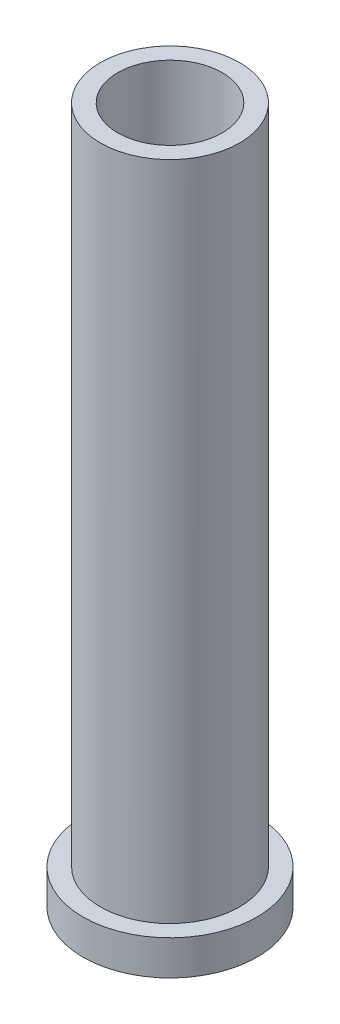
ISO-10303-21;
HEADER;
FILE_DESCRIPTION(('STEP AP214'),'2;1');
FILE_NAME('part.step','',(''),(''),'','','');
FILE_SCHEMA(('AUTOMOTIVE_DESIGN { 1 0 10303 214 1 1 1 1 }'));
ENDSEC;
DATA;
#1=APPLICATION_CONTEXT('core data for automotive mechanical design processes');
#2=APPLICATION_PROTOCOL_DEFINITION('international standard','automotive_design',2000,#1);
#3=PRODUCT_CONTEXT('',#1,'mechanical');
#4=PRODUCT('Part','Part','',(#3));
#5=PRODUCT_RELATED_PRODUCT_CATEGORY('part','',(#4));
#6=PRODUCT_DEFINITION_FORMATION('','',#4);
#7=PRODUCT_DEFINITION_CONTEXT('part definition',#1,'design');
#8=PRODUCT_DEFINITION('design','',#6,#7);
#9=PRODUCT_DEFINITION_SHAPE('','',#8);
#10=(LENGTH_UNIT() NAMED_UNIT(*) SI_UNIT(.MILLI.,.METRE.));
#11=(NAMED_UNIT(*) PLANE_ANGLE_UNIT() SI_UNIT($,.RADIAN.));
#12=(NAMED_UNIT(*) SI_UNIT($,.STERADIAN.) SOLID_ANGLE_UNIT());
#13=UNCERTAINTY_MEASURE_WITH_UNIT(LENGTH_MEASURE(1.E-05),#10,'distance_accuracy_value','');
#14=(GEOMETRIC_REPRESENTATION_CONTEXT(3) GLOBAL_UNCERTAINTY_ASSIGNED_CONTEXT((#13)) GLOBAL_UNIT_ASSIGNED_CONTEXT((#10,
#11,#12)) REPRESENTATION_CONTEXT('',''));
#15=CARTESIAN_POINT('',(0.,0.,0.));
#16=DIRECTION('',(0.,0.,1.));
#17=DIRECTION('',(1.,0.,0.));
#18=AXIS2_PLACEMENT_3D('',#15,#16,#17);
#19=CARTESIAN_POINT('',(0.,38.,0.));
#20=DIRECTION('',(0.,-1.,0.));
#21=DIRECTION('',(0.,0.,-1.));
#22=AXIS2_PLACEMENT_3D('',#19,#20,#21);
#23=CYLINDRICAL_SURFACE('',#22,4.);
#24=CARTESIAN_POINT('',(0.,38.,0.));
#25=DIRECTION('',(0.,1.,0.));
#26=DIRECTION('',(0.,0.,1.));
#27=AXIS2_PLACEMENT_3D('',#24,#25,#26);
#28=CIRCLE('',#27,4.);
#29=CARTESIAN_POINT('',(0.,38.,4.));
#30=VERTEX_POINT('',#29);
#31=EDGE_CURVE('E10',#30,#30,#28,.T.);
#32=ORIENTED_EDGE('',*,*,#31,.F.);
#33=EDGE_LOOP('',(#32));
#34=FACE_BOUND('',#33,.T.);
#35=CARTESIAN_POINT('',(0.,0.,0.));
#36=DIRECTION('',(0.,-1.,0.));
#37=DIRECTION('',(0.,0.,-1.));
#38=AXIS2_PLACEMENT_3D('',#35,#36,#37);
#39=CIRCLE('',#38,4.);
#40=CARTESIAN_POINT('',(0.,0.,-4.));
#41=VERTEX_POINT('',#40);
#42=EDGE_CURVE('E37',#41,#41,#39,.T.);
#43=ORIENTED_EDGE('',*,*,#42,.F.);
#44=EDGE_LOOP('',(#43));
#45=FACE_BOUND('',#44,.T.);
#46=ADVANCED_FACE('F30',(#34,#45),#23,.T.);
#47=CARTESIAN_POINT('',(0.,38.,0.));
#48=DIRECTION('',(0.,1.,0.));
#49=DIRECTION('',(0.,0.,1.));
#50=AXIS2_PLACEMENT_3D('',#47,#48,#49);
#51=PLANE('',#50);
#52=CARTESIAN_POINT('',(0.,38.,0.));
#53=DIRECTION('',(0.,1.,0.));
#54=DIRECTION('',(0.,0.,1.));
#55=AXIS2_PLACEMENT_3D('',#52,#53,#54);
#56=CIRCLE('',#55,3.);
#57=CARTESIAN_POINT('',(0.,38.,3.));
#58=VERTEX_POINT('',#57);
#59=EDGE_CURVE('E49',#58,#58,#56,.T.);
#60=ORIENTED_EDGE('',*,*,#59,.F.);
#61=EDGE_LOOP('',(#60));
#62=FACE_BOUND('',#61,.T.);
#63=ORIENTED_EDGE('',*,*,#31,.T.);
#64=EDGE_LOOP('',(#63));
#65=FACE_BOUND('',#64,.T.);
#66=ADVANCED_FACE('F68',(#62,#65),#51,.T.);
#67=CARTESIAN_POINT('',(0.,-2.,0.));
#68=DIRECTION('',(0.,1.,0.));
#69=DIRECTION('',(0.,0.,1.));
#70=AXIS2_PLACEMENT_3D('',#67,#68,#69);
#71=CYLINDRICAL_SURFACE('',#70,5.);
#72=CARTESIAN_POINT('',(0.,-2.,0.));
#73=DIRECTION('',(0.,-1.,0.));
#74=DIRECTION('',(0.,0.,-1.));
#75=AXIS2_PLACEMENT_3D('',#72,#73,#74);
#76=CIRCLE('',#75,5.);
#77=CARTESIAN_POINT('',(0.,-2.,-5.));
#78=VERTEX_POINT('',#77);
#79=EDGE_CURVE('E41',#78,#78,#76,.T.);
#80=ORIENTED_EDGE('',*,*,#79,.F.);
#81=EDGE_LOOP('',(#80));
#82=FACE_BOUND('',#81,.T.);
#83=CARTESIAN_POINT('',(0.,0.,0.));
#84=DIRECTION('',(0.,-1.,0.));
#85=DIRECTION('',(0.,0.,-1.));
#86=AXIS2_PLACEMENT_3D('',#83,#84,#85);
#87=CIRCLE('',#86,5.);
#88=CARTESIAN_POINT('',(0.,0.,-5.));
#89=VERTEX_POINT('',#88);
#90=EDGE_CURVE('E44',#89,#89,#87,.T.);
#91=ORIENTED_EDGE('',*,*,#90,.T.);
#92=EDGE_LOOP('',(#91));
#93=FACE_BOUND('',#92,.T.);
#94=ADVANCED_FACE('F62',(#82,#93),#71,.T.);
#95=CARTESIAN_POINT('',(0.,-2.,0.));
#96=DIRECTION('',(0.,-1.,0.));
#97=DIRECTION('',(0.,0.,-1.));
#98=AXIS2_PLACEMENT_3D('',#95,#96,#97);
#99=PLANE('',#98);
#100=CARTESIAN_POINT('',(0.,-2.,0.));
#101=DIRECTION('',(0.,-1.,0.));
#102=DIRECTION('',(0.,0.,-1.));
#103=AXIS2_PLACEMENT_3D('',#100,#101,#102);
#104=CIRCLE('',#103,3.);
#105=CARTESIAN_POINT('',(0.,-2.,3.));
#106=VERTEX_POINT('',#105);
#107=EDGE_CURVE('E33',#106,#106,#104,.T.);
#108=ORIENTED_EDGE('',*,*,#107,.F.);
#109=EDGE_LOOP('',(#108));
#110=FACE_BOUND('',#109,.T.);
#111=ORIENTED_EDGE('',*,*,#79,.T.);
#112=EDGE_LOOP('',(#111));
#113=FACE_BOUND('',#112,.T.);
#114=ADVANCED_FACE('F58',(#110,#113),#99,.T.);
#115=CARTESIAN_POINT('',(0.,0.,0.));
#116=DIRECTION('',(0.,-1.,0.));
#117=DIRECTION('',(0.,0.,-1.));
#118=AXIS2_PLACEMENT_3D('',#115,#116,#117);
#119=PLANE('',#118);
#120=ORIENTED_EDGE('',*,*,#42,.T.);
#121=EDGE_LOOP('',(#120));
#122=FACE_BOUND('',#121,.T.);
#123=ORIENTED_EDGE('',*,*,#90,.F.);
#124=EDGE_LOOP('',(#123));
#125=FACE_BOUND('',#124,.T.);
#126=ADVANCED_FACE('F61',(#122,#125),#119,.F.);
#127=CARTESIAN_POINT('',(0.,-3.00000000000001,0.));
#128=DIRECTION('',(0.,1.,0.));
#129=DIRECTION('',(0.,0.,1.));
#130=AXIS2_PLACEMENT_3D('',#127,#128,#129);
#131=CYLINDRICAL_SURFACE('',#130,3.);
#132=CARTESIAN_POINT('',(0.,-2.,3.));
#133=CARTESIAN_POINT('',(0.,-1.58333333333333,3.));
#134=CARTESIAN_POINT('',(0.,-1.16666666666667,3.));
#135=CARTESIAN_POINT('',(0.,-0.333333333333334,3.));
#136=CARTESIAN_POINT('',(0.,0.0833333333333331,3.));
#137=CARTESIAN_POINT('',(0.,0.916666666666666,3.));
#138=CARTESIAN_POINT('',(0.,1.33333333333333,3.));
#139=CARTESIAN_POINT('',(0.,2.16666666666667,3.));
#140=CARTESIAN_POINT('',(0.,2.58333333333333,3.));
#141=CARTESIAN_POINT('',(0.,3.41666666666667,3.));
#142=CARTESIAN_POINT('',(0.,3.83333333333333,3.));
#143=CARTESIAN_POINT('',(0.,4.66666666666667,3.));
#144=CARTESIAN_POINT('',(0.,5.08333333333333,3.));
#145=CARTESIAN_POINT('',(0.,5.91666666666666,3.));
#146=CARTESIAN_POINT('',(0.,6.33333333333333,3.));
#147=CARTESIAN_POINT('',(0.,7.16666666666667,3.));
#148=CARTESIAN_POINT('',(0.,7.58333333333333,3.));
#149=CARTESIAN_POINT('',(0.,8.41666666666666,3.));
#150=CARTESIAN_POINT('',(0.,8.83333333333333,3.));
#151=CARTESIAN_POINT('',(0.,9.66666666666667,3.));
#152=CARTESIAN_POINT('',(0.,10.0833333333333,3.));
#153=CARTESIAN_POINT('',(0.,10.9166666666667,3.));
#154=CARTESIAN_POINT('',(0.,11.3333333333333,3.));
#155=CARTESIAN_POINT('',(0.,12.1666666666667,3.));
#156=CARTESIAN_POINT('',(0.,12.5833333333333,3.));
#157=CARTESIAN_POINT('',(0.,13.4166666666667,3.));
#158=CARTESIAN_POINT('',(0.,13.8333333333333,3.));
#159=CARTESIAN_POINT('',(0.,14.6666666666667,3.));
#160=CARTESIAN_POINT('',(0.,15.0833333333333,3.));
#161=CARTESIAN_POINT('',(0.,15.9166666666667,3.));
#162=CARTESIAN_POINT('',(0.,16.3333333333333,3.));
#163=CARTESIAN_POINT('',(0.,17.1666666666667,3.));
#164=CARTESIAN_POINT('',(0.,17.5833333333333,3.));
#165=CARTESIAN_POINT('',(0.,18.4166666666667,3.));
#166=CARTESIAN_POINT('',(0.,18.8333333333333,3.));
#167=CARTESIAN_POINT('',(0.,19.6666666666667,3.));
#168=CARTESIAN_POINT('',(0.,20.0833333333333,3.));
#169=CARTESIAN_POINT('',(0.,20.9166666666667,3.));
#170=CARTESIAN_POINT('',(0.,21.3333333333333,3.));
#171=CARTESIAN_POINT('',(0.,22.1666666666667,3.));
#172=CARTESIAN_POINT('',(0.,22.5833333333333,3.));
#173=CARTESIAN_POINT('',(0.,23.4166666666667,3.));
#174=CARTESIAN_POINT('',(0.,23.8333333333333,3.));
#175=CARTESIAN_POINT('',(0.,24.6666666666667,3.));
#176=CARTESIAN_POINT('',(0.,25.0833333333333,3.));
#177=CARTESIAN_POINT('',(0.,25.9166666666667,3.));
#178=CARTESIAN_POINT('',(0.,26.3333333333333,3.));
#179=CARTESIAN_POINT('',(0.,27.1666666666667,3.));
#180=CARTESIAN_POINT('',(0.,27.5833333333333,3.));
#181=CARTESIAN_POINT('',(0.,28.4166666666667,3.));
#182=CARTESIAN_POINT('',(0.,28.8333333333333,3.));
#183=CARTESIAN_POINT('',(0.,29.6666666666667,3.));
#184=CARTESIAN_POINT('',(0.,30.0833333333333,3.));
#185=CARTESIAN_POINT('',(0.,30.9166666666667,3.));
#186=CARTESIAN_POINT('',(0.,31.3333333333333,3.));
#187=CARTESIAN_POINT('',(0.,32.1666666666667,3.));
#188=CARTESIAN_POINT('',(0.,32.5833333333333,3.));
#189=CARTESIAN_POINT('',(0.,33.4166666666667,3.));
#190=CARTESIAN_POINT('',(0.,33.8333333333333,3.));
#191=CARTESIAN_POINT('',(0.,34.6666666666667,3.));
#192=CARTESIAN_POINT('',(0.,35.0833333333333,3.));
#193=CARTESIAN_POINT('',(0.,35.9166666666667,3.));
#194=CARTESIAN_POINT('',(0.,36.3333333333333,3.));
#195=CARTESIAN_POINT('',(0.,37.1666666666667,3.));
#196=CARTESIAN_POINT('',(0.,37.5833333333333,3.));
#197=CARTESIAN_POINT('',(0.,38.,3.));
#198=B_SPLINE_CURVE_WITH_KNOTS('',3,(#132,#133,#134,#135,#136,#137,#138,#139,#140,#141,#142,
#143,#144,#145,#146,#147,#148,#149,#150,#151,#152,#153,#154,#155,#156,#157,#158,#159,#160,#161,
#162,#163,#164,#165,#166,#167,#168,#169,#170,#171,#172,#173,#174,#175,#176,#177,#178,#179,#180,
#181,#182,#183,#184,#185,#186,#187,#188,#189,#190,#191,#192,#193,#194,#195,#196,#197),
.UNSPECIFIED.,.F.,.F.,(4,2,2,2,2,2,2,2,2,2,2,2,2,2,2,2,2,2,2,2,2,2,2,2,2,2,2,2,2,2,2,2,4),(0.,
1.25,2.5,3.75,5.,6.25,7.5,8.75,10.,11.25,12.5,13.75,15.,16.25,17.5,18.75,20.,21.25,22.5,23.75,
25.,26.25,27.5,28.75,30.,31.25,32.5,33.75,35.,36.25,37.5,38.75,40.),.UNSPECIFIED.);
#199=EDGE_CURVE('BSEAM56',#106,#58,#198,.T.);
#200=ORIENTED_EDGE('',*,*,#107,.T.);
#201=ORIENTED_EDGE('',*,*,#59,.T.);
#202=ORIENTED_EDGE('',*,*,#199,.T.);
#203=ORIENTED_EDGE('',*,*,#199,.F.);
#204=EDGE_LOOP('',(#200,#202,#201,#203));
#205=FACE_BOUND('',#204,.T.);
#206=ADVANCED_FACE('F56',(#205),#131,.F.);
#207=CLOSED_SHELL('',(#46,#66,#94,#114,#126,#206));
#208=MANIFOLD_SOLID_BREP('B2',#207);
#209=ADVANCED_BREP_SHAPE_REPRESENTATION('',(#18,#208),#14);
#210=SHAPE_DEFINITION_REPRESENTATION(#9,#209);
ENDSEC;
END-ISO-10303-21;
